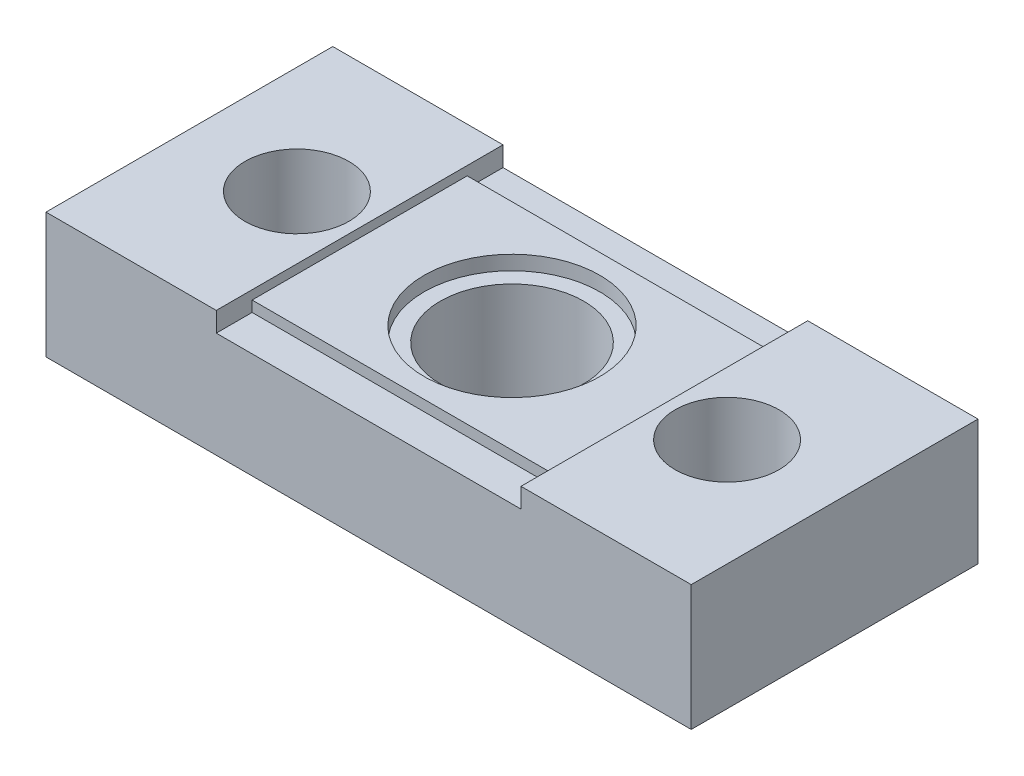
ISO-10303-21;
HEADER;
FILE_DESCRIPTION(('STEP AP214'),'2;1');
FILE_NAME('part.step','',(''),(''),'','','');
FILE_SCHEMA(('AUTOMOTIVE_DESIGN { 1 0 10303 214 1 1 1 1 }'));
ENDSEC;
DATA;
#1=APPLICATION_CONTEXT('core data for automotive mechanical design processes');
#2=APPLICATION_PROTOCOL_DEFINITION('international standard','automotive_design',2000,#1);
#3=PRODUCT_CONTEXT('',#1,'mechanical');
#4=PRODUCT('Part','Part','',(#3));
#5=PRODUCT_RELATED_PRODUCT_CATEGORY('part','',(#4));
#6=PRODUCT_DEFINITION_FORMATION('','',#4);
#7=PRODUCT_DEFINITION_CONTEXT('part definition',#1,'design');
#8=PRODUCT_DEFINITION('design','',#6,#7);
#9=PRODUCT_DEFINITION_SHAPE('','',#8);
#10=(LENGTH_UNIT() NAMED_UNIT(*) SI_UNIT(.MILLI.,.METRE.));
#11=(NAMED_UNIT(*) PLANE_ANGLE_UNIT() SI_UNIT($,.RADIAN.));
#12=(NAMED_UNIT(*) SI_UNIT($,.STERADIAN.) SOLID_ANGLE_UNIT());
#13=UNCERTAINTY_MEASURE_WITH_UNIT(LENGTH_MEASURE(1.E-05),#10,'distance_accuracy_value','');
#14=(GEOMETRIC_REPRESENTATION_CONTEXT(3) GLOBAL_UNCERTAINTY_ASSIGNED_CONTEXT((#13)) GLOBAL_UNIT_ASSIGNED_CONTEXT((#10,
#11,#12)) REPRESENTATION_CONTEXT('',''));
#15=CARTESIAN_POINT('',(0.,0.,0.));
#16=DIRECTION('',(0.,0.,1.));
#17=DIRECTION('',(1.,0.,0.));
#18=AXIS2_PLACEMENT_3D('',#15,#16,#17);
#19=CARTESIAN_POINT('',(-18.,7.,-8.));
#20=DIRECTION('',(0.,0.,1.));
#21=DIRECTION('',(1.,0.,0.));
#22=AXIS2_PLACEMENT_3D('',#19,#20,#21);
#23=PLANE('',#22);
#24=DIRECTION('',(0.,1.,0.));
#25=VECTOR('',#24,1.);
#26=CARTESIAN_POINT('',(-8.5,7.00000000000007,-8.));
#27=LINE('',#26,#25);
#28=CARTESIAN_POINT('',(-8.5,5.9,-8.));
#29=VERTEX_POINT('',#28);
#30=CARTESIAN_POINT('',(-8.5,7.,-8.));
#31=VERTEX_POINT('',#30);
#32=EDGE_CURVE('E202',#29,#31,#27,.T.);
#33=ORIENTED_EDGE('',*,*,#32,.F.);
#34=DIRECTION('',(-1.,0.,0.));
#35=VECTOR('',#34,1.);
#36=CARTESIAN_POINT('',(-8.5,5.9,-8.));
#37=LINE('',#36,#35);
#38=CARTESIAN_POINT('',(8.5,5.9,-8.));
#39=VERTEX_POINT('',#38);
#40=EDGE_CURVE('E175',#39,#29,#37,.T.);
#41=ORIENTED_EDGE('',*,*,#40,.F.);
#42=DIRECTION('',(0.,-1.,0.));
#43=VECTOR('',#42,1.);
#44=CARTESIAN_POINT('',(8.5,7.,-8.));
#45=LINE('',#44,#43);
#46=CARTESIAN_POINT('',(8.5,7.,-8.));
#47=VERTEX_POINT('',#46);
#48=EDGE_CURVE('E207',#47,#39,#45,.T.);
#49=ORIENTED_EDGE('',*,*,#48,.F.);
#50=DIRECTION('',(-1.,0.,0.));
#51=VECTOR('',#50,1.);
#52=CARTESIAN_POINT('',(-18.,7.,-8.));
#53=LINE('',#52,#51);
#54=CARTESIAN_POINT('',(18.,7.,-8.));
#55=VERTEX_POINT('',#54);
#56=EDGE_CURVE('E215',#55,#47,#53,.T.);
#57=ORIENTED_EDGE('',*,*,#56,.F.);
#58=DIRECTION('',(0.,-1.,0.));
#59=VECTOR('',#58,1.);
#60=CARTESIAN_POINT('',(18.,7.,-8.));
#61=LINE('',#60,#59);
#62=CARTESIAN_POINT('',(18.,0.,-8.));
#63=VERTEX_POINT('',#62);
#64=EDGE_CURVE('E238',#55,#63,#61,.T.);
#65=ORIENTED_EDGE('',*,*,#64,.T.);
#66=DIRECTION('',(-1.,0.,0.));
#67=VECTOR('',#66,1.);
#68=CARTESIAN_POINT('',(-18.,0.,-8.));
#69=LINE('',#68,#67);
#70=CARTESIAN_POINT('',(-18.,0.,-8.));
#71=VERTEX_POINT('',#70);
#72=EDGE_CURVE('E225',#63,#71,#69,.T.);
#73=ORIENTED_EDGE('',*,*,#72,.T.);
#74=DIRECTION('',(0.,-1.,0.));
#75=VECTOR('',#74,1.);
#76=CARTESIAN_POINT('',(-18.,7.,-8.));
#77=LINE('',#76,#75);
#78=CARTESIAN_POINT('',(-18.,7.,-8.));
#79=VERTEX_POINT('',#78);
#80=EDGE_CURVE('E235',#79,#71,#77,.T.);
#81=ORIENTED_EDGE('',*,*,#80,.F.);
#82=EDGE_CURVE('E213',#31,#79,#53,.T.);
#83=ORIENTED_EDGE('',*,*,#82,.F.);
#84=EDGE_LOOP('',(#33,#41,#49,#57,#65,#73,#81,#83));
#85=FACE_BOUND('',#84,.T.);
#86=ADVANCED_FACE('F45',(#85),#23,.F.);
#87=CARTESIAN_POINT('',(-18.,7.,8.));
#88=DIRECTION('',(0.,0.,-1.));
#89=DIRECTION('',(-1.,0.,0.));
#90=AXIS2_PLACEMENT_3D('',#87,#88,#89);
#91=PLANE('',#90);
#92=DIRECTION('',(0.,1.,0.));
#93=VECTOR('',#92,1.);
#94=CARTESIAN_POINT('',(8.5,7.,8.));
#95=LINE('',#94,#93);
#96=CARTESIAN_POINT('',(8.5,5.9,8.));
#97=VERTEX_POINT('',#96);
#98=CARTESIAN_POINT('',(8.5,7.,8.));
#99=VERTEX_POINT('',#98);
#100=EDGE_CURVE('E205',#97,#99,#95,.T.);
#101=ORIENTED_EDGE('',*,*,#100,.F.);
#102=DIRECTION('',(1.,0.,0.));
#103=VECTOR('',#102,1.);
#104=CARTESIAN_POINT('',(8.5,5.9,8.));
#105=LINE('',#104,#103);
#106=CARTESIAN_POINT('',(-8.5,5.9,8.));
#107=VERTEX_POINT('',#106);
#108=EDGE_CURVE('E143',#107,#97,#105,.T.);
#109=ORIENTED_EDGE('',*,*,#108,.F.);
#110=DIRECTION('',(0.,-1.,0.));
#111=VECTOR('',#110,1.);
#112=CARTESIAN_POINT('',(-8.5,7.00000000000007,8.));
#113=LINE('',#112,#111);
#114=CARTESIAN_POINT('',(-8.5,7.,7.99999999999997));
#115=VERTEX_POINT('',#114);
#116=EDGE_CURVE('E200',#115,#107,#113,.T.);
#117=ORIENTED_EDGE('',*,*,#116,.F.);
#118=DIRECTION('',(1.,0.,0.));
#119=VECTOR('',#118,1.);
#120=CARTESIAN_POINT('',(-18.,7.,8.));
#121=LINE('',#120,#119);
#122=CARTESIAN_POINT('',(-18.,7.,8.));
#123=VERTEX_POINT('',#122);
#124=EDGE_CURVE('E220',#123,#115,#121,.T.);
#125=ORIENTED_EDGE('',*,*,#124,.F.);
#126=DIRECTION('',(0.,-1.,0.));
#127=VECTOR('',#126,1.);
#128=CARTESIAN_POINT('',(-18.,7.,8.));
#129=LINE('',#128,#127);
#130=CARTESIAN_POINT('',(-18.,0.,8.));
#131=VERTEX_POINT('',#130);
#132=EDGE_CURVE('E232',#123,#131,#129,.T.);
#133=ORIENTED_EDGE('',*,*,#132,.T.);
#134=DIRECTION('',(1.,0.,0.));
#135=VECTOR('',#134,1.);
#136=CARTESIAN_POINT('',(-18.,0.,8.));
#137=LINE('',#136,#135);
#138=CARTESIAN_POINT('',(18.,0.,8.));
#139=VERTEX_POINT('',#138);
#140=EDGE_CURVE('E214',#131,#139,#137,.T.);
#141=ORIENTED_EDGE('',*,*,#140,.T.);
#142=DIRECTION('',(0.,-1.,0.));
#143=VECTOR('',#142,1.);
#144=CARTESIAN_POINT('',(18.,7.,8.));
#145=LINE('',#144,#143);
#146=CARTESIAN_POINT('',(18.,7.,8.));
#147=VERTEX_POINT('',#146);
#148=EDGE_CURVE('E222',#147,#139,#145,.T.);
#149=ORIENTED_EDGE('',*,*,#148,.F.);
#150=EDGE_CURVE('E219',#99,#147,#121,.T.);
#151=ORIENTED_EDGE('',*,*,#150,.F.);
#152=EDGE_LOOP('',(#101,#109,#117,#125,#133,#141,#149,#151));
#153=FACE_BOUND('',#152,.T.);
#154=ADVANCED_FACE('F260',(#153),#91,.F.);
#155=CARTESIAN_POINT('',(0.,7.,0.));
#156=DIRECTION('',(0.,-1.,0.));
#157=DIRECTION('',(0.,0.,-1.));
#158=AXIS2_PLACEMENT_3D('',#155,#156,#157);
#159=PLANE('',#158);
#160=CARTESIAN_POINT('',(12.,7.,0.));
#161=DIRECTION('',(0.,1.,0.));
#162=DIRECTION('',(0.,0.,1.));
#163=AXIS2_PLACEMENT_3D('',#160,#161,#162);
#164=CIRCLE('',#163,2.9);
#165=CARTESIAN_POINT('',(12.,7.,2.9));
#166=VERTEX_POINT('',#165);
#167=EDGE_CURVE('E467',#166,#166,#164,.T.);
#168=ORIENTED_EDGE('',*,*,#167,.F.);
#169=EDGE_LOOP('',(#168));
#170=FACE_BOUND('',#169,.T.);
#171=DIRECTION('',(0.,0.,-1.));
#172=VECTOR('',#171,1.);
#173=CARTESIAN_POINT('',(8.5,7.,0.));
#174=LINE('',#173,#172);
#175=EDGE_CURVE('E13',#99,#47,#174,.T.);
#176=ORIENTED_EDGE('',*,*,#175,.F.);
#177=ORIENTED_EDGE('',*,*,#150,.T.);
#178=DIRECTION('',(0.,0.,-1.));
#179=VECTOR('',#178,1.);
#180=CARTESIAN_POINT('',(18.,7.,8.));
#181=LINE('',#180,#179);
#182=EDGE_CURVE('E210',#147,#55,#181,.T.);
#183=ORIENTED_EDGE('',*,*,#182,.T.);
#184=ORIENTED_EDGE('',*,*,#56,.T.);
#185=EDGE_LOOP('',(#176,#177,#183,#184));
#186=FACE_BOUND('',#185,.T.);
#187=ADVANCED_FACE('F295',(#170,#186),#159,.F.);
#188=CARTESIAN_POINT('',(-12.,7.,0.));
#189=DIRECTION('',(0.,1.,0.));
#190=DIRECTION('',(0.,0.,1.));
#191=AXIS2_PLACEMENT_3D('',#188,#189,#190);
#192=CIRCLE('',#191,2.9);
#193=CARTESIAN_POINT('',(-12.,7.,2.9));
#194=VERTEX_POINT('',#193);
#195=EDGE_CURVE('E159',#194,#194,#192,.T.);
#196=ORIENTED_EDGE('',*,*,#195,.F.);
#197=EDGE_LOOP('',(#196));
#198=FACE_BOUND('',#197,.T.);
#199=DIRECTION('',(0.,0.,1.));
#200=VECTOR('',#199,1.);
#201=CARTESIAN_POINT('',(-8.5,7.,0.));
#202=LINE('',#201,#200);
#203=EDGE_CURVE('E53',#31,#115,#202,.T.);
#204=ORIENTED_EDGE('',*,*,#203,.F.);
#205=ORIENTED_EDGE('',*,*,#82,.T.);
#206=DIRECTION('',(0.,0.,1.));
#207=VECTOR('',#206,1.);
#208=CARTESIAN_POINT('',(-18.,7.,8.));
#209=LINE('',#208,#207);
#210=EDGE_CURVE('E217',#79,#123,#209,.T.);
#211=ORIENTED_EDGE('',*,*,#210,.T.);
#212=ORIENTED_EDGE('',*,*,#124,.T.);
#213=EDGE_LOOP('',(#204,#205,#211,#212));
#214=FACE_BOUND('',#213,.T.);
#215=ADVANCED_FACE('F248',(#198,#214),#159,.F.);
#216=CARTESIAN_POINT('',(18.,7.,8.));
#217=DIRECTION('',(-1.,0.,0.));
#218=DIRECTION('',(0.,0.,1.));
#219=AXIS2_PLACEMENT_3D('',#216,#217,#218);
#220=PLANE('',#219);
#221=DIRECTION('',(0.,0.,-1.));
#222=VECTOR('',#221,1.);
#223=CARTESIAN_POINT('',(18.,0.,8.));
#224=LINE('',#223,#222);
#225=EDGE_CURVE('E209',#139,#63,#224,.T.);
#226=ORIENTED_EDGE('',*,*,#225,.T.);
#227=ORIENTED_EDGE('',*,*,#64,.F.);
#228=ORIENTED_EDGE('',*,*,#182,.F.);
#229=ORIENTED_EDGE('',*,*,#148,.T.);
#230=EDGE_LOOP('',(#226,#227,#228,#229));
#231=FACE_BOUND('',#230,.T.);
#232=ADVANCED_FACE('F47',(#231),#220,.F.);
#233=CARTESIAN_POINT('',(-18.,7.,8.));
#234=DIRECTION('',(1.,0.,0.));
#235=DIRECTION('',(0.,0.,-1.));
#236=AXIS2_PLACEMENT_3D('',#233,#234,#235);
#237=PLANE('',#236);
#238=DIRECTION('',(0.,0.,1.));
#239=VECTOR('',#238,1.);
#240=CARTESIAN_POINT('',(-18.,0.,8.));
#241=LINE('',#240,#239);
#242=EDGE_CURVE('E227',#71,#131,#241,.T.);
#243=ORIENTED_EDGE('',*,*,#242,.T.);
#244=ORIENTED_EDGE('',*,*,#132,.F.);
#245=ORIENTED_EDGE('',*,*,#210,.F.);
#246=ORIENTED_EDGE('',*,*,#80,.T.);
#247=EDGE_LOOP('',(#243,#244,#245,#246));
#248=FACE_BOUND('',#247,.T.);
#249=ADVANCED_FACE('F257',(#248),#237,.F.);
#250=CARTESIAN_POINT('',(0.,0.,0.));
#251=DIRECTION('',(0.,-1.,0.));
#252=DIRECTION('',(0.,0.,-1.));
#253=AXIS2_PLACEMENT_3D('',#250,#251,#252);
#254=PLANE('',#253);
#255=CARTESIAN_POINT('',(12.,0.,0.));
#256=DIRECTION('',(0.,1.,0.));
#257=DIRECTION('',(0.,0.,1.));
#258=AXIS2_PLACEMENT_3D('',#255,#256,#257);
#259=CIRCLE('',#258,2.9);
#260=CARTESIAN_POINT('',(12.,0.,2.9));
#261=VERTEX_POINT('',#260);
#262=EDGE_CURVE('E464',#261,#261,#259,.T.);
#263=ORIENTED_EDGE('',*,*,#262,.T.);
#264=EDGE_LOOP('',(#263));
#265=FACE_BOUND('',#264,.T.);
#266=CARTESIAN_POINT('',(-12.,0.,0.));
#267=DIRECTION('',(0.,1.,0.));
#268=DIRECTION('',(0.,0.,1.));
#269=AXIS2_PLACEMENT_3D('',#266,#267,#268);
#270=CIRCLE('',#269,2.9);
#271=CARTESIAN_POINT('',(-12.,0.,2.9));
#272=VERTEX_POINT('',#271);
#273=EDGE_CURVE('E156',#272,#272,#270,.T.);
#274=ORIENTED_EDGE('',*,*,#273,.T.);
#275=EDGE_LOOP('',(#274));
#276=FACE_BOUND('',#275,.T.);
#277=CARTESIAN_POINT('',(0.,0.,0.));
#278=DIRECTION('',(0.,1.,0.));
#279=DIRECTION('',(-1.,0.,0.));
#280=AXIS2_PLACEMENT_3D('',#277,#278,#279);
#281=CIRCLE('',#280,4.);
#282=CARTESIAN_POINT('',(-4.,0.,0.));
#283=VERTEX_POINT('',#282);
#284=EDGE_CURVE('E185',#283,#283,#281,.T.);
#285=ORIENTED_EDGE('',*,*,#284,.T.);
#286=EDGE_LOOP('',(#285));
#287=FACE_BOUND('',#286,.T.);
#288=ORIENTED_EDGE('',*,*,#225,.F.);
#289=ORIENTED_EDGE('',*,*,#140,.F.);
#290=ORIENTED_EDGE('',*,*,#242,.F.);
#291=ORIENTED_EDGE('',*,*,#72,.F.);
#292=EDGE_LOOP('',(#288,#289,#290,#291));
#293=FACE_BOUND('',#292,.T.);
#294=ADVANCED_FACE('F273',(#265,#276,#287,#293),#254,.T.);
#295=CARTESIAN_POINT('',(8.5,6.5,-58.0156225593564));
#296=DIRECTION('',(0.,1.,0.));
#297=DIRECTION('',(-1.,0.,0.));
#298=AXIS2_PLACEMENT_3D('',#295,#296,#297);
#299=PLANE('',#298);
#300=DIRECTION('',(-1.,0.,0.));
#301=VECTOR('',#300,1.);
#302=CARTESIAN_POINT('',(8.5,6.5,6.));
#303=LINE('',#302,#301);
#304=CARTESIAN_POINT('',(8.5,6.5,6.));
#305=VERTEX_POINT('',#304);
#306=CARTESIAN_POINT('',(-8.5,6.5,5.99999999999997));
#307=VERTEX_POINT('',#306);
#308=EDGE_CURVE('E60',#305,#307,#303,.T.);
#309=ORIENTED_EDGE('',*,*,#308,.F.);
#310=DIRECTION('',(0.,0.,1.));
#311=VECTOR('',#310,1.);
#312=CARTESIAN_POINT('',(8.5,6.5,-58.0156225593564));
#313=LINE('',#312,#311);
#314=CARTESIAN_POINT('',(8.5,6.5,-6.));
#315=VERTEX_POINT('',#314);
#316=EDGE_CURVE('E141',#315,#305,#313,.T.);
#317=ORIENTED_EDGE('',*,*,#316,.F.);
#318=DIRECTION('',(1.,0.,0.));
#319=VECTOR('',#318,1.);
#320=CARTESIAN_POINT('',(-8.5,6.5,-6.));
#321=LINE('',#320,#319);
#322=CARTESIAN_POINT('',(-8.5,6.5,-6.));
#323=VERTEX_POINT('',#322);
#324=EDGE_CURVE('E164',#323,#315,#321,.T.);
#325=ORIENTED_EDGE('',*,*,#324,.F.);
#326=DIRECTION('',(0.,0.,1.));
#327=VECTOR('',#326,1.);
#328=CARTESIAN_POINT('',(-8.5,6.5,-58.0156225593564));
#329=LINE('',#328,#327);
#330=EDGE_CURVE('E194',#323,#307,#329,.T.);
#331=ORIENTED_EDGE('',*,*,#330,.T.);
#332=EDGE_LOOP('',(#309,#317,#325,#331));
#333=FACE_BOUND('',#332,.T.);
#334=CARTESIAN_POINT('',(0.,6.5,0.));
#335=DIRECTION('',(0.,1.,0.));
#336=DIRECTION('',(-1.,0.,0.));
#337=AXIS2_PLACEMENT_3D('',#334,#335,#336);
#338=CIRCLE('',#337,4.9);
#339=CARTESIAN_POINT('',(-4.9,6.5,0.));
#340=VERTEX_POINT('',#339);
#341=EDGE_CURVE('E188',#340,#340,#338,.T.);
#342=ORIENTED_EDGE('',*,*,#341,.F.);
#343=EDGE_LOOP('',(#342));
#344=FACE_BOUND('',#343,.T.);
#345=ADVANCED_FACE('F270',(#333,#344),#299,.T.);
#346=CARTESIAN_POINT('',(8.5,7.,-58.0156225593564));
#347=DIRECTION('',(-1.,0.,0.));
#348=DIRECTION('',(0.,0.,1.));
#349=AXIS2_PLACEMENT_3D('',#346,#347,#348);
#350=PLANE('',#349);
#351=ORIENTED_EDGE('',*,*,#175,.T.);
#352=ORIENTED_EDGE('',*,*,#48,.T.);
#353=DIRECTION('',(0.,0.,-1.));
#354=VECTOR('',#353,1.);
#355=CARTESIAN_POINT('',(8.5,5.9,-8.));
#356=LINE('',#355,#354);
#357=CARTESIAN_POINT('',(8.5,5.9,-6.));
#358=VERTEX_POINT('',#357);
#359=EDGE_CURVE('E172',#358,#39,#356,.T.);
#360=ORIENTED_EDGE('',*,*,#359,.F.);
#361=DIRECTION('',(0.,1.,0.));
#362=VECTOR('',#361,1.);
#363=CARTESIAN_POINT('',(8.5,5.9,-6.));
#364=LINE('',#363,#362);
#365=EDGE_CURVE('E181',#358,#315,#364,.T.);
#366=ORIENTED_EDGE('',*,*,#365,.T.);
#367=ORIENTED_EDGE('',*,*,#316,.T.);
#368=DIRECTION('',(0.,1.,0.));
#369=VECTOR('',#368,1.);
#370=CARTESIAN_POINT('',(8.5,5.9,6.));
#371=LINE('',#370,#369);
#372=CARTESIAN_POINT('',(8.5,5.9,6.));
#373=VERTEX_POINT('',#372);
#374=EDGE_CURVE('E133',#373,#305,#371,.T.);
#375=ORIENTED_EDGE('',*,*,#374,.F.);
#376=DIRECTION('',(0.,0.,-1.));
#377=VECTOR('',#376,1.);
#378=CARTESIAN_POINT('',(8.5,5.9,8.));
#379=LINE('',#378,#377);
#380=EDGE_CURVE('E138',#97,#373,#379,.T.);
#381=ORIENTED_EDGE('',*,*,#380,.F.);
#382=ORIENTED_EDGE('',*,*,#100,.T.);
#383=EDGE_LOOP('',(#351,#352,#360,#366,#367,#375,#381,#382));
#384=FACE_BOUND('',#383,.T.);
#385=ADVANCED_FACE('F135',(#384),#350,.T.);
#386=CARTESIAN_POINT('',(-8.5,6.5,-58.0156225593564));
#387=DIRECTION('',(1.,0.,0.));
#388=DIRECTION('',(0.,1.,0.));
#389=AXIS2_PLACEMENT_3D('',#386,#387,#388);
#390=PLANE('',#389);
#391=ORIENTED_EDGE('',*,*,#330,.F.);
#392=DIRECTION('',(0.,1.,0.));
#393=VECTOR('',#392,1.);
#394=CARTESIAN_POINT('',(-8.5,5.9,-6.));
#395=LINE('',#394,#393);
#396=CARTESIAN_POINT('',(-8.5,5.9,-6.));
#397=VERTEX_POINT('',#396);
#398=EDGE_CURVE('E178',#397,#323,#395,.T.);
#399=ORIENTED_EDGE('',*,*,#398,.F.);
#400=DIRECTION('',(0.,0.,1.));
#401=VECTOR('',#400,1.);
#402=CARTESIAN_POINT('',(-8.5,5.9,-8.));
#403=LINE('',#402,#401);
#404=EDGE_CURVE('E166',#29,#397,#403,.T.);
#405=ORIENTED_EDGE('',*,*,#404,.F.);
#406=ORIENTED_EDGE('',*,*,#32,.T.);
#407=ORIENTED_EDGE('',*,*,#203,.T.);
#408=ORIENTED_EDGE('',*,*,#116,.T.);
#409=DIRECTION('',(0.,0.,1.));
#410=VECTOR('',#409,1.);
#411=CARTESIAN_POINT('',(-8.5,5.9,8.));
#412=LINE('',#411,#410);
#413=CARTESIAN_POINT('',(-8.5,5.9,6.));
#414=VERTEX_POINT('',#413);
#415=EDGE_CURVE('E151',#414,#107,#412,.T.);
#416=ORIENTED_EDGE('',*,*,#415,.F.);
#417=DIRECTION('',(0.,1.,0.));
#418=VECTOR('',#417,1.);
#419=CARTESIAN_POINT('',(-8.5,5.9,6.));
#420=LINE('',#419,#418);
#421=EDGE_CURVE('E142',#414,#307,#420,.T.);
#422=ORIENTED_EDGE('',*,*,#421,.T.);
#423=EDGE_LOOP('',(#391,#399,#405,#406,#407,#408,#416,#422));
#424=FACE_BOUND('',#423,.T.);
#425=ADVANCED_FACE('F243',(#424),#390,.T.);
#426=CARTESIAN_POINT('',(0.,5.7,0.));
#427=DIRECTION('',(0.,1.,0.));
#428=DIRECTION('',(-1.,0.,0.));
#429=AXIS2_PLACEMENT_3D('',#426,#427,#428);
#430=CYLINDRICAL_SURFACE('',#429,4.9);
#431=CARTESIAN_POINT('',(0.,5.7,0.));
#432=DIRECTION('',(0.,1.,0.));
#433=DIRECTION('',(-1.,0.,0.));
#434=AXIS2_PLACEMENT_3D('',#431,#432,#433);
#435=CIRCLE('',#434,4.9);
#436=CARTESIAN_POINT('',(-4.9,5.7,0.));
#437=VERTEX_POINT('',#436);
#438=EDGE_CURVE('E191',#437,#437,#435,.T.);
#439=ORIENTED_EDGE('',*,*,#438,.F.);
#440=EDGE_LOOP('',(#439));
#441=FACE_BOUND('',#440,.T.);
#442=ORIENTED_EDGE('',*,*,#341,.T.);
#443=EDGE_LOOP('',(#442));
#444=FACE_BOUND('',#443,.T.);
#445=ADVANCED_FACE('F277',(#441,#444),#430,.F.);
#446=CARTESIAN_POINT('',(0.,5.7,0.));
#447=DIRECTION('',(0.,1.,0.));
#448=DIRECTION('',(-1.,0.,0.));
#449=AXIS2_PLACEMENT_3D('',#446,#447,#448);
#450=PLANE('',#449);
#451=CARTESIAN_POINT('',(0.,5.7,0.));
#452=DIRECTION('',(0.,1.,0.));
#453=DIRECTION('',(-1.,0.,0.));
#454=AXIS2_PLACEMENT_3D('',#451,#452,#453);
#455=CIRCLE('',#454,4.);
#456=CARTESIAN_POINT('',(-4.,5.7,0.));
#457=VERTEX_POINT('',#456);
#458=EDGE_CURVE('E183',#457,#457,#455,.T.);
#459=ORIENTED_EDGE('',*,*,#458,.F.);
#460=EDGE_LOOP('',(#459));
#461=FACE_BOUND('',#460,.T.);
#462=ORIENTED_EDGE('',*,*,#438,.T.);
#463=EDGE_LOOP('',(#462));
#464=FACE_BOUND('',#463,.T.);
#465=ADVANCED_FACE('F279',(#461,#464),#450,.T.);
#466=CARTESIAN_POINT('',(0.,0.,0.));
#467=DIRECTION('',(0.,1.,0.));
#468=DIRECTION('',(-1.,0.,0.));
#469=AXIS2_PLACEMENT_3D('',#466,#467,#468);
#470=CYLINDRICAL_SURFACE('',#469,4.);
#471=ORIENTED_EDGE('',*,*,#284,.F.);
#472=EDGE_LOOP('',(#471));
#473=FACE_BOUND('',#472,.T.);
#474=ORIENTED_EDGE('',*,*,#458,.T.);
#475=EDGE_LOOP('',(#474));
#476=FACE_BOUND('',#475,.T.);
#477=ADVANCED_FACE('F286',(#473,#476),#470,.F.);
#478=CARTESIAN_POINT('',(-8.5,5.9,-6.));
#479=DIRECTION('',(0.,0.,1.));
#480=DIRECTION('',(1.,0.,0.));
#481=AXIS2_PLACEMENT_3D('',#478,#479,#480);
#482=PLANE('',#481);
#483=ORIENTED_EDGE('',*,*,#324,.T.);
#484=ORIENTED_EDGE('',*,*,#365,.F.);
#485=DIRECTION('',(1.,0.,0.));
#486=VECTOR('',#485,1.);
#487=CARTESIAN_POINT('',(-8.5,5.9,-6.));
#488=LINE('',#487,#486);
#489=EDGE_CURVE('E169',#397,#358,#488,.T.);
#490=ORIENTED_EDGE('',*,*,#489,.F.);
#491=ORIENTED_EDGE('',*,*,#398,.T.);
#492=EDGE_LOOP('',(#483,#484,#490,#491));
#493=FACE_BOUND('',#492,.T.);
#494=ADVANCED_FACE('F267',(#493),#482,.F.);
#495=CARTESIAN_POINT('',(0.,5.9,0.));
#496=DIRECTION('',(0.,1.,0.));
#497=DIRECTION('',(-1.,0.,0.));
#498=AXIS2_PLACEMENT_3D('',#495,#496,#497);
#499=PLANE('',#498);
#500=ORIENTED_EDGE('',*,*,#404,.T.);
#501=ORIENTED_EDGE('',*,*,#489,.T.);
#502=ORIENTED_EDGE('',*,*,#359,.T.);
#503=ORIENTED_EDGE('',*,*,#40,.T.);
#504=EDGE_LOOP('',(#500,#501,#502,#503));
#505=FACE_BOUND('',#504,.T.);
#506=ADVANCED_FACE('F264',(#505),#499,.T.);
#507=CARTESIAN_POINT('',(8.5,5.9,6.));
#508=DIRECTION('',(0.,0.,-1.));
#509=DIRECTION('',(-1.,0.,0.));
#510=AXIS2_PLACEMENT_3D('',#507,#508,#509);
#511=PLANE('',#510);
#512=ORIENTED_EDGE('',*,*,#308,.T.);
#513=ORIENTED_EDGE('',*,*,#421,.F.);
#514=DIRECTION('',(-1.,0.,0.));
#515=VECTOR('',#514,1.);
#516=CARTESIAN_POINT('',(8.5,5.9,6.));
#517=LINE('',#516,#515);
#518=EDGE_CURVE('E146',#373,#414,#517,.T.);
#519=ORIENTED_EDGE('',*,*,#518,.F.);
#520=ORIENTED_EDGE('',*,*,#374,.T.);
#521=EDGE_LOOP('',(#512,#513,#519,#520));
#522=FACE_BOUND('',#521,.T.);
#523=ADVANCED_FACE('F147',(#522),#511,.F.);
#524=CARTESIAN_POINT('',(0.,5.9,0.));
#525=DIRECTION('',(0.,1.,0.));
#526=DIRECTION('',(-1.,0.,0.));
#527=AXIS2_PLACEMENT_3D('',#524,#525,#526);
#528=PLANE('',#527);
#529=ORIENTED_EDGE('',*,*,#380,.T.);
#530=ORIENTED_EDGE('',*,*,#518,.T.);
#531=ORIENTED_EDGE('',*,*,#415,.T.);
#532=ORIENTED_EDGE('',*,*,#108,.T.);
#533=EDGE_LOOP('',(#529,#530,#531,#532));
#534=FACE_BOUND('',#533,.T.);
#535=ADVANCED_FACE('F153',(#534),#528,.T.);
#536=CARTESIAN_POINT('',(-12.,0.,0.));
#537=DIRECTION('',(0.,1.,0.));
#538=DIRECTION('',(0.,0.,1.));
#539=AXIS2_PLACEMENT_3D('',#536,#537,#538);
#540=CYLINDRICAL_SURFACE('',#539,2.9);
#541=ORIENTED_EDGE('',*,*,#273,.F.);
#542=EDGE_LOOP('',(#541));
#543=FACE_BOUND('',#542,.T.);
#544=ORIENTED_EDGE('',*,*,#195,.T.);
#545=EDGE_LOOP('',(#544));
#546=FACE_BOUND('',#545,.T.);
#547=ADVANCED_FACE('F334',(#543,#546),#540,.F.);
#548=CARTESIAN_POINT('',(12.,0.,0.));
#549=DIRECTION('',(0.,1.,0.));
#550=DIRECTION('',(0.,0.,1.));
#551=AXIS2_PLACEMENT_3D('',#548,#549,#550);
#552=CYLINDRICAL_SURFACE('',#551,2.9);
#553=ORIENTED_EDGE('',*,*,#262,.F.);
#554=EDGE_LOOP('',(#553));
#555=FACE_BOUND('',#554,.T.);
#556=ORIENTED_EDGE('',*,*,#167,.T.);
#557=EDGE_LOOP('',(#556));
#558=FACE_BOUND('',#557,.T.);
#559=ADVANCED_FACE('F366',(#555,#558),#552,.F.);
#560=CLOSED_SHELL('',(#86,#154,#187,#215,#232,#249,#294,#345,#385,#425,#445,#465,#477,#494,#506,
#523,#535,#547,#559));
#561=MANIFOLD_SOLID_BREP('B2',#560);
#562=ADVANCED_BREP_SHAPE_REPRESENTATION('',(#18,#561),#14);
#563=SHAPE_DEFINITION_REPRESENTATION(#9,#562);
ENDSEC;
END-ISO-10303-21;
